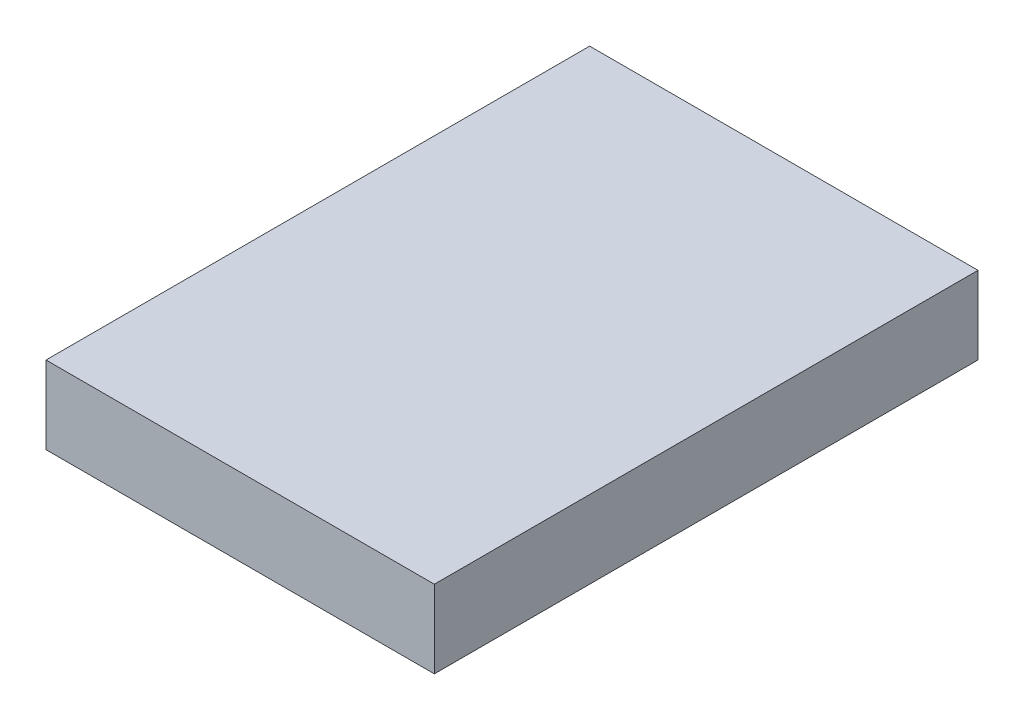
ISO-10303-21;
HEADER;
FILE_DESCRIPTION(('STEP AP214'),'2;1');
FILE_NAME('part.step','',(''),(''),'','','');
FILE_SCHEMA(('AUTOMOTIVE_DESIGN { 1 0 10303 214 1 1 1 1 }'));
ENDSEC;
DATA;
#1=APPLICATION_CONTEXT('core data for automotive mechanical design processes');
#2=APPLICATION_PROTOCOL_DEFINITION('international standard','automotive_design',2000,#1);
#3=PRODUCT_CONTEXT('',#1,'mechanical');
#4=PRODUCT('Part','Part','',(#3));
#5=PRODUCT_RELATED_PRODUCT_CATEGORY('part','',(#4));
#6=PRODUCT_DEFINITION_FORMATION('','',#4);
#7=PRODUCT_DEFINITION_CONTEXT('part definition',#1,'design');
#8=PRODUCT_DEFINITION('design','',#6,#7);
#9=PRODUCT_DEFINITION_SHAPE('','',#8);
#10=(LENGTH_UNIT() NAMED_UNIT(*) SI_UNIT(.MILLI.,.METRE.));
#11=(NAMED_UNIT(*) PLANE_ANGLE_UNIT() SI_UNIT($,.RADIAN.));
#12=(NAMED_UNIT(*) SI_UNIT($,.STERADIAN.) SOLID_ANGLE_UNIT());
#13=UNCERTAINTY_MEASURE_WITH_UNIT(LENGTH_MEASURE(1.E-05),#10,'distance_accuracy_value','');
#14=(GEOMETRIC_REPRESENTATION_CONTEXT(3) GLOBAL_UNCERTAINTY_ASSIGNED_CONTEXT((#13)) GLOBAL_UNIT_ASSIGNED_CONTEXT((#10,
#11,#12)) REPRESENTATION_CONTEXT('',''));
#15=CARTESIAN_POINT('',(0.,0.,0.));
#16=DIRECTION('',(0.,0.,1.));
#17=DIRECTION('',(1.,0.,0.));
#18=AXIS2_PLACEMENT_3D('',#15,#16,#17);
#19=CARTESIAN_POINT('',(15.,6.,-21.));
#20=DIRECTION('',(-1.,0.,0.));
#21=DIRECTION('',(0.,0.,1.));
#22=AXIS2_PLACEMENT_3D('',#19,#20,#21);
#23=PLANE('',#22);
#24=DIRECTION('',(0.,0.,-1.));
#25=VECTOR('',#24,1.);
#26=CARTESIAN_POINT('',(15.,0.,-21.));
#27=LINE('',#26,#25);
#28=CARTESIAN_POINT('',(15.,0.,21.));
#29=VERTEX_POINT('',#28);
#30=CARTESIAN_POINT('',(15.,0.,-21.));
#31=VERTEX_POINT('',#30);
#32=EDGE_CURVE('E101',#29,#31,#27,.T.);
#33=ORIENTED_EDGE('',*,*,#32,.T.);
#34=DIRECTION('',(0.,-1.,0.));
#35=VECTOR('',#34,1.);
#36=CARTESIAN_POINT('',(15.,6.,-21.));
#37=LINE('',#36,#35);
#38=CARTESIAN_POINT('',(15.,6.,-21.));
#39=VERTEX_POINT('',#38);
#40=EDGE_CURVE('E11',#39,#31,#37,.T.);
#41=ORIENTED_EDGE('',*,*,#40,.F.);
#42=DIRECTION('',(0.,0.,-1.));
#43=VECTOR('',#42,1.);
#44=CARTESIAN_POINT('',(15.,6.,-21.));
#45=LINE('',#44,#43);
#46=CARTESIAN_POINT('',(15.,6.,21.));
#47=VERTEX_POINT('',#46);
#48=EDGE_CURVE('E89',#47,#39,#45,.T.);
#49=ORIENTED_EDGE('',*,*,#48,.F.);
#50=DIRECTION('',(0.,-1.,0.));
#51=VECTOR('',#50,1.);
#52=CARTESIAN_POINT('',(15.,6.,21.));
#53=LINE('',#52,#51);
#54=EDGE_CURVE('E97',#47,#29,#53,.T.);
#55=ORIENTED_EDGE('',*,*,#54,.T.);
#56=EDGE_LOOP('',(#33,#41,#49,#55));
#57=FACE_BOUND('',#56,.T.);
#58=ADVANCED_FACE('F38',(#57),#23,.F.);
#59=CARTESIAN_POINT('',(-15.,6.,-21.));
#60=DIRECTION('',(0.,0.,1.));
#61=DIRECTION('',(1.,0.,0.));
#62=AXIS2_PLACEMENT_3D('',#59,#60,#61);
#63=PLANE('',#62);
#64=DIRECTION('',(-1.,0.,0.));
#65=VECTOR('',#64,1.);
#66=CARTESIAN_POINT('',(-15.,0.,-21.));
#67=LINE('',#66,#65);
#68=CARTESIAN_POINT('',(-15.,0.,-21.));
#69=VERTEX_POINT('',#68);
#70=EDGE_CURVE('E93',#31,#69,#67,.T.);
#71=ORIENTED_EDGE('',*,*,#70,.T.);
#72=DIRECTION('',(0.,-1.,0.));
#73=VECTOR('',#72,1.);
#74=CARTESIAN_POINT('',(-15.,6.,-21.));
#75=LINE('',#74,#73);
#76=CARTESIAN_POINT('',(-15.,6.,-21.));
#77=VERTEX_POINT('',#76);
#78=EDGE_CURVE('E46',#77,#69,#75,.T.);
#79=ORIENTED_EDGE('',*,*,#78,.F.);
#80=DIRECTION('',(-1.,0.,0.));
#81=VECTOR('',#80,1.);
#82=CARTESIAN_POINT('',(-15.,6.,-21.));
#83=LINE('',#82,#81);
#84=EDGE_CURVE('E84',#39,#77,#83,.T.);
#85=ORIENTED_EDGE('',*,*,#84,.F.);
#86=ORIENTED_EDGE('',*,*,#40,.T.);
#87=EDGE_LOOP('',(#71,#79,#85,#86));
#88=FACE_BOUND('',#87,.T.);
#89=ADVANCED_FACE('F92',(#88),#63,.F.);
#90=CARTESIAN_POINT('',(-15.,6.,-21.));
#91=DIRECTION('',(1.,0.,0.));
#92=DIRECTION('',(0.,0.,-1.));
#93=AXIS2_PLACEMENT_3D('',#90,#91,#92);
#94=PLANE('',#93);
#95=DIRECTION('',(0.,0.,1.));
#96=VECTOR('',#95,1.);
#97=CARTESIAN_POINT('',(-15.,0.,-21.));
#98=LINE('',#97,#96);
#99=CARTESIAN_POINT('',(-15.,0.,21.));
#100=VERTEX_POINT('',#99);
#101=EDGE_CURVE('E71',#69,#100,#98,.T.);
#102=ORIENTED_EDGE('',*,*,#101,.T.);
#103=DIRECTION('',(0.,-1.,0.));
#104=VECTOR('',#103,1.);
#105=CARTESIAN_POINT('',(-15.,6.,21.));
#106=LINE('',#105,#104);
#107=CARTESIAN_POINT('',(-15.,6.,21.));
#108=VERTEX_POINT('',#107);
#109=EDGE_CURVE('E94',#108,#100,#106,.T.);
#110=ORIENTED_EDGE('',*,*,#109,.F.);
#111=DIRECTION('',(0.,0.,1.));
#112=VECTOR('',#111,1.);
#113=CARTESIAN_POINT('',(-15.,6.,-21.));
#114=LINE('',#113,#112);
#115=EDGE_CURVE('E87',#77,#108,#114,.T.);
#116=ORIENTED_EDGE('',*,*,#115,.F.);
#117=ORIENTED_EDGE('',*,*,#78,.T.);
#118=EDGE_LOOP('',(#102,#110,#116,#117));
#119=FACE_BOUND('',#118,.T.);
#120=ADVANCED_FACE('F95',(#119),#94,.F.);
#121=CARTESIAN_POINT('',(-15.,6.,21.));
#122=DIRECTION('',(0.,0.,-1.));
#123=DIRECTION('',(-1.,0.,0.));
#124=AXIS2_PLACEMENT_3D('',#121,#122,#123);
#125=PLANE('',#124);
#126=DIRECTION('',(1.,0.,0.));
#127=VECTOR('',#126,1.);
#128=CARTESIAN_POINT('',(-15.,0.,21.));
#129=LINE('',#128,#127);
#130=EDGE_CURVE('E77',#100,#29,#129,.T.);
#131=ORIENTED_EDGE('',*,*,#130,.T.);
#132=ORIENTED_EDGE('',*,*,#54,.F.);
#133=DIRECTION('',(1.,0.,0.));
#134=VECTOR('',#133,1.);
#135=CARTESIAN_POINT('',(-15.,6.,21.));
#136=LINE('',#135,#134);
#137=EDGE_CURVE('E54',#108,#47,#136,.T.);
#138=ORIENTED_EDGE('',*,*,#137,.F.);
#139=ORIENTED_EDGE('',*,*,#109,.T.);
#140=EDGE_LOOP('',(#131,#132,#138,#139));
#141=FACE_BOUND('',#140,.T.);
#142=ADVANCED_FACE('F108',(#141),#125,.F.);
#143=CARTESIAN_POINT('',(0.,6.,0.));
#144=DIRECTION('',(0.,1.,0.));
#145=DIRECTION('',(0.,0.,1.));
#146=AXIS2_PLACEMENT_3D('',#143,#144,#145);
#147=PLANE('',#146);
#148=ORIENTED_EDGE('',*,*,#48,.T.);
#149=ORIENTED_EDGE('',*,*,#84,.T.);
#150=ORIENTED_EDGE('',*,*,#115,.T.);
#151=ORIENTED_EDGE('',*,*,#137,.T.);
#152=EDGE_LOOP('',(#148,#149,#150,#151));
#153=FACE_BOUND('',#152,.T.);
#154=ADVANCED_FACE('F85',(#153),#147,.T.);
#155=CARTESIAN_POINT('',(0.,0.,0.));
#156=DIRECTION('',(0.,1.,0.));
#157=DIRECTION('',(0.,0.,1.));
#158=AXIS2_PLACEMENT_3D('',#155,#156,#157);
#159=PLANE('',#158);
#160=ORIENTED_EDGE('',*,*,#32,.F.);
#161=ORIENTED_EDGE('',*,*,#130,.F.);
#162=ORIENTED_EDGE('',*,*,#101,.F.);
#163=ORIENTED_EDGE('',*,*,#70,.F.);
#164=EDGE_LOOP('',(#160,#161,#162,#163));
#165=FACE_BOUND('',#164,.T.);
#166=ADVANCED_FACE('F111',(#165),#159,.F.);
#167=CLOSED_SHELL('',(#58,#89,#120,#142,#154,#166));
#168=MANIFOLD_SOLID_BREP('B2',#167);
#169=ADVANCED_BREP_SHAPE_REPRESENTATION('',(#18,#168),#14);
#170=SHAPE_DEFINITION_REPRESENTATION(#9,#169);
ENDSEC;
END-ISO-10303-21;
